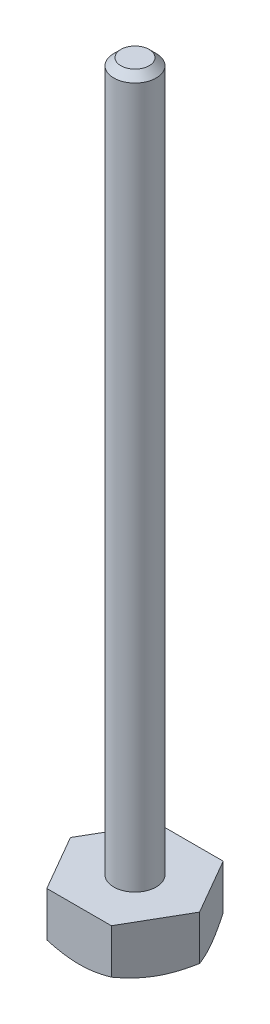
ISO-10303-21;
HEADER;
FILE_DESCRIPTION(('STEP AP214'),'2;1');
FILE_NAME('part.step','',(''),(''),'','','');
FILE_SCHEMA(('AUTOMOTIVE_DESIGN { 1 0 10303 214 1 1 1 1 }'));
ENDSEC;
DATA;
#1=APPLICATION_CONTEXT('core data for automotive mechanical design processes');
#2=APPLICATION_PROTOCOL_DEFINITION('international standard','automotive_design',2000,#1);
#3=PRODUCT_CONTEXT('',#1,'mechanical');
#4=PRODUCT('Part','Part','',(#3));
#5=PRODUCT_RELATED_PRODUCT_CATEGORY('part','',(#4));
#6=PRODUCT_DEFINITION_FORMATION('','',#4);
#7=PRODUCT_DEFINITION_CONTEXT('part definition',#1,'design');
#8=PRODUCT_DEFINITION('design','',#6,#7);
#9=PRODUCT_DEFINITION_SHAPE('','',#8);
#10=(LENGTH_UNIT() NAMED_UNIT(*) SI_UNIT(.MILLI.,.METRE.));
#11=(NAMED_UNIT(*) PLANE_ANGLE_UNIT() SI_UNIT($,.RADIAN.));
#12=(NAMED_UNIT(*) SI_UNIT($,.STERADIAN.) SOLID_ANGLE_UNIT());
#13=UNCERTAINTY_MEASURE_WITH_UNIT(LENGTH_MEASURE(1.E-05),#10,'distance_accuracy_value','');
#14=(GEOMETRIC_REPRESENTATION_CONTEXT(3) GLOBAL_UNCERTAINTY_ASSIGNED_CONTEXT((#13)) GLOBAL_UNIT_ASSIGNED_CONTEXT((#10,
#11,#12)) REPRESENTATION_CONTEXT('',''));
#15=CARTESIAN_POINT('',(0.,0.,0.));
#16=DIRECTION('',(0.,0.,1.));
#17=DIRECTION('',(1.,0.,0.));
#18=AXIS2_PLACEMENT_3D('',#15,#16,#17);
#19=CARTESIAN_POINT('',(2.28053356329902,53.5,3.95));
#20=DIRECTION('',(-0.866025403784439,0.,-0.5));
#21=DIRECTION('',(-0.5,0.,0.866025403784439));
#22=AXIS2_PLACEMENT_3D('',#19,#20,#21);
#23=PLANE('',#22);
#24=DIRECTION('',(0.,-1.,0.));
#25=VECTOR('',#24,1.);
#26=CARTESIAN_POINT('',(2.28053356329902,53.5,3.95));
#27=LINE('',#26,#25);
#28=CARTESIAN_POINT('',(2.28053356329902,3.5,3.95));
#29=VERTEX_POINT('',#28);
#30=CARTESIAN_POINT('',(2.28053356329902,0.352799770034311,3.95));
#31=VERTEX_POINT('',#30);
#32=EDGE_CURVE('E200',#29,#31,#27,.T.);
#33=ORIENTED_EDGE('',*,*,#32,.T.);
#34=CARTESIAN_POINT('',(2.28041809324518,0.352866439232559,3.9502));
#35=CARTESIAN_POINT('',(2.38063568061467,0.29498466517833,3.77661804686408));
#36=CARTESIAN_POINT('',(2.48171834047415,0.242343384693469,3.60153774422325));
#37=CARTESIAN_POINT('',(2.68563399767937,0.15045769122082,3.24834546548501));
#38=CARTESIAN_POINT('',(2.78847061820894,0.111245783680884,3.07022721384912));
#39=CARTESIAN_POINT('',(2.99286939806646,0.0502069964662325,2.71619814213081));
#40=CARTESIAN_POINT('',(3.09440010889697,0.0279738669923628,2.54034179244378));
#41=CARTESIAN_POINT('',(3.2979392458968,0.00143257410152678,2.18780166583136));
#42=CARTESIAN_POINT('',(3.39994693229981,-0.0028975682651904,2.01111917021878));
#43=CARTESIAN_POINT('',(3.59055257085472,0.0061125958312302,1.68098052003257));
#44=CARTESIAN_POINT('',(3.67917906182971,0.0172406019947407,1.52747493476735));
#45=CARTESIAN_POINT('',(3.85585464520722,0.0525092384080949,1.22146384790063));
#46=CARTESIAN_POINT('',(3.94390312656325,0.0766619154689032,1.06895940466271));
#47=CARTESIAN_POINT('',(4.1209429556258,0.137041499215026,0.762317425763064));
#48=CARTESIAN_POINT('',(4.20991189711042,0.173524342732937,0.60821869881607));
#49=CARTESIAN_POINT('',(4.386522859466,0.256325958671651,0.302319538842572));
#50=CARTESIAN_POINT('',(4.47416714283355,0.302625276645222,0.150515187057013));
#51=CARTESIAN_POINT('',(4.56118259665188,0.35286643923256,-0.000199999999999486));
#52=B_SPLINE_CURVE_WITH_KNOTS('',3,(#34,#35,#36,#37,#38,#39,#40,#41,#42,#43,#44,#45,#46,#47,#48,
#49,#50,#51),.UNSPECIFIED.,.F.,.F.,(4,2,2,2,2,2,2,2,4),(0.,0.626122435414088,1.25374984683404,
1.86584388199859,2.47718624449848,3.00948555938868,3.54227805643855,4.08688849089222,
4.63042953105667),.UNSPECIFIED.);
#53=CARTESIAN_POINT('',(3.42080034494853,0.,1.975));
#54=VERTEX_POINT('',#53);
#55=EDGE_CURVE('E56',#31,#54,#52,.T.);
#56=ORIENTED_EDGE('',*,*,#55,.T.);
#57=CARTESIAN_POINT('',(4.56106712659804,0.352799770034312,0.));
#58=VERTEX_POINT('',#57);
#59=EDGE_CURVE('E180',#54,#58,#52,.T.);
#60=ORIENTED_EDGE('',*,*,#59,.T.);
#61=DIRECTION('',(0.,-1.,0.));
#62=VECTOR('',#61,1.);
#63=CARTESIAN_POINT('',(4.56106712659804,53.5,0.));
#64=LINE('',#63,#62);
#65=CARTESIAN_POINT('',(4.56106712659804,3.5,0.));
#66=VERTEX_POINT('',#65);
#67=EDGE_CURVE('E212',#66,#58,#64,.T.);
#68=ORIENTED_EDGE('',*,*,#67,.F.);
#69=DIRECTION('',(0.5,0.,-0.866025403784439));
#70=VECTOR('',#69,1.);
#71=CARTESIAN_POINT('',(2.28053356329902,3.5,3.95));
#72=LINE('',#71,#70);
#73=EDGE_CURVE('E198',#29,#66,#72,.T.);
#74=ORIENTED_EDGE('',*,*,#73,.F.);
#75=EDGE_LOOP('',(#33,#56,#60,#68,#74));
#76=FACE_BOUND('',#75,.T.);
#77=ADVANCED_FACE('F34',(#76),#23,.F.);
#78=CARTESIAN_POINT('',(4.56106712659804,53.5,0.));
#79=DIRECTION('',(-0.866025403784438,0.,0.5));
#80=DIRECTION('',(0.5,0.,0.866025403784439));
#81=AXIS2_PLACEMENT_3D('',#78,#79,#80);
#82=PLANE('',#81);
#83=ORIENTED_EDGE('',*,*,#67,.T.);
#84=CARTESIAN_POINT('',(4.56118259665188,0.35286643923256,0.000200000000000792));
#85=CARTESIAN_POINT('',(4.4609650092824,0.294984665178331,-0.173381953135922));
#86=CARTESIAN_POINT('',(4.35988234942291,0.24234338469347,-0.348462255776748));
#87=CARTESIAN_POINT('',(4.15596669221769,0.150457691220819,-0.701654534514986));
#88=CARTESIAN_POINT('',(4.05313007168813,0.111245783680884,-0.879772786150876));
#89=CARTESIAN_POINT('',(3.84873129183061,0.0502069964662322,-1.23380185786919));
#90=CARTESIAN_POINT('',(3.74720058100009,0.0279738669923626,-1.40965820755622));
#91=CARTESIAN_POINT('',(3.54366144400027,0.00143257410152646,-1.76219833416864));
#92=CARTESIAN_POINT('',(3.44165375759725,-0.002897568265191,-1.93888082978122));
#93=CARTESIAN_POINT('',(3.25104811904234,0.00611259583122921,-2.26901947996743));
#94=CARTESIAN_POINT('',(3.16242162806736,0.0172406019947396,-2.42252506523265));
#95=CARTESIAN_POINT('',(2.98574604468985,0.0525092384080937,-2.72853615209937));
#96=CARTESIAN_POINT('',(2.89769756333382,0.0766619154689019,-2.88104059533729));
#97=CARTESIAN_POINT('',(2.72065773427127,0.137041499215025,-3.18768257423694));
#98=CARTESIAN_POINT('',(2.63168879278664,0.173524342732935,-3.34178130118393));
#99=CARTESIAN_POINT('',(2.45507783043106,0.25632595867165,-3.64768046115743));
#100=CARTESIAN_POINT('',(2.36743354706351,0.302625276645221,-3.79948481294299));
#101=CARTESIAN_POINT('',(2.28041809324518,0.352866439232559,-3.9502));
#102=B_SPLINE_CURVE_WITH_KNOTS('',3,(#84,#85,#86,#87,#88,#89,#90,#91,#92,#93,#94,#95,#96,#97,
#98,#99,#100,#101),.UNSPECIFIED.,.F.,.F.,(4,2,2,2,2,2,2,2,4),(0.,0.626122435414089,
1.25374984683404,1.86584388199859,2.47718624449848,3.00948555938868,3.54227805643855,
4.08688849089222,4.63042953105668),.UNSPECIFIED.);
#103=CARTESIAN_POINT('',(3.42080034494853,0.,-1.975));
#104=VERTEX_POINT('',#103);
#105=EDGE_CURVE('E143',#58,#104,#102,.T.);
#106=ORIENTED_EDGE('',*,*,#105,.T.);
#107=CARTESIAN_POINT('',(2.28053356329902,0.352799770034311,-3.95));
#108=VERTEX_POINT('',#107);
#109=EDGE_CURVE('E125',#104,#108,#102,.T.);
#110=ORIENTED_EDGE('',*,*,#109,.T.);
#111=DIRECTION('',(0.,-1.,0.));
#112=VECTOR('',#111,1.);
#113=CARTESIAN_POINT('',(2.28053356329902,53.5,-3.95));
#114=LINE('',#113,#112);
#115=CARTESIAN_POINT('',(2.28053356329902,3.5,-3.95));
#116=VERTEX_POINT('',#115);
#117=EDGE_CURVE('E142',#116,#108,#114,.T.);
#118=ORIENTED_EDGE('',*,*,#117,.F.);
#119=DIRECTION('',(-0.5,0.,-0.866025403784439));
#120=VECTOR('',#119,1.);
#121=CARTESIAN_POINT('',(4.56106712659804,3.5,0.));
#122=LINE('',#121,#120);
#123=EDGE_CURVE('E196',#66,#116,#122,.T.);
#124=ORIENTED_EDGE('',*,*,#123,.F.);
#125=EDGE_LOOP('',(#83,#106,#110,#118,#124));
#126=FACE_BOUND('',#125,.T.);
#127=ADVANCED_FACE('F171',(#126),#82,.F.);
#128=CARTESIAN_POINT('',(2.28053356329902,53.5,-3.95));
#129=DIRECTION('',(0.,0.,1.));
#130=DIRECTION('',(1.,0.,0.));
#131=AXIS2_PLACEMENT_3D('',#128,#129,#130);
#132=PLANE('',#131);
#133=ORIENTED_EDGE('',*,*,#117,.T.);
#134=CARTESIAN_POINT('',(-6.10357758199648,1.91693231106891,-3.95));
#135=CARTESIAN_POINT('',(-5.93124296341037,1.83342413986499,-3.95));
#136=CARTESIAN_POINT('',(-5.75851034716177,1.7507231237423,-3.95));
#137=CARTESIAN_POINT('',(-5.41203738808505,1.58738980517233,-3.95));
#138=CARTESIAN_POINT('',(-5.23829688964106,1.50675783320087,-3.95));
#139=CARTESIAN_POINT('',(-4.88869053692414,1.34760657001449,-3.95));
#140=CARTESIAN_POINT('',(-4.71281824674957,1.26910136723712,-3.95));
#141=CARTESIAN_POINT('',(-4.35966706590354,1.11533340183023,-3.95));
#142=CARTESIAN_POINT('',(-4.18238824282438,1.04007048449381,-3.95));
#143=CARTESIAN_POINT('',(-3.82050032721837,0.89132492021823,-3.95));
#144=CARTESIAN_POINT('',(-3.63583679895024,0.817973982970938,-3.95));
#145=CARTESIAN_POINT('',(-3.26434104766608,0.676877601703548,-3.95));
#146=CARTESIAN_POINT('',(-3.07750858274522,0.60913278992708,-3.95));
#147=CARTESIAN_POINT('',(-2.70173475211593,0.481043410509852,-3.95));
#148=CARTESIAN_POINT('',(-2.51279861234366,0.420683666781782,-3.95));
#149=CARTESIAN_POINT('',(-2.13221628603157,0.309315998631552,-3.95));
#150=CARTESIAN_POINT('',(-1.9405709808664,0.258305104875555,-3.95));
#151=CARTESIAN_POINT('',(-1.55552434463117,0.168368778188127,-3.95));
#152=CARTESIAN_POINT('',(-1.36213845471526,0.129378460835559,-3.95));
#153=CARTESIAN_POINT('',(-0.972985101602572,0.0657013823696122,-3.95));
#154=CARTESIAN_POINT('',(-0.777217857929892,0.0410133128601275,-3.95));
#155=CARTESIAN_POINT('',(-0.386827068328998,0.00823383358748254,-3.95));
#156=CARTESIAN_POINT('',(-0.192221734876161,-6.91438180813361E-05,-3.95));
#157=CARTESIAN_POINT('',(0.196997929016572,6.99774314488553E-05,-3.95));
#158=CARTESIAN_POINT('',(0.391612259559857,0.00851243380211182,-3.95));
#159=CARTESIAN_POINT('',(0.722677109724479,0.0365237749212534,-3.95));
#160=CARTESIAN_POINT('',(0.859484148618515,0.0521141661874182,-3.95));
#161=CARTESIAN_POINT('',(1.13207609093672,0.0905871323117199,-3.95));
#162=CARTESIAN_POINT('',(1.26786085001275,0.113470717925195,-3.95));
#163=CARTESIAN_POINT('',(1.67351297163642,0.191856311837088,-3.95));
#164=CARTESIAN_POINT('',(1.94152194628906,0.257078202966896,-3.95));
#165=CARTESIAN_POINT('',(2.34222812581931,0.369908571745236,-3.95));
#166=CARTESIAN_POINT('',(2.47700932246483,0.410535217395792,-3.95));
#167=CARTESIAN_POINT('',(2.74526197374985,0.49594181803233,-3.95));
#168=CARTESIAN_POINT('',(2.87873341992142,0.540721799851382,-3.95));
#169=CARTESIAN_POINT('',(3.1444100594592,0.633722017418443,-3.95));
#170=CARTESIAN_POINT('',(3.27661566965515,0.68194107318557,-3.95));
#171=CARTESIAN_POINT('',(3.53993613663676,0.781258796495595,-3.95));
#172=CARTESIAN_POINT('',(3.67105100463013,0.83235743440785,-3.95));
#173=CARTESIAN_POINT('',(3.97386714290639,0.95359226728304,-3.95));
#174=CARTESIAN_POINT('',(4.1452130929492,1.02461418324626,-3.95));
#175=CARTESIAN_POINT('',(4.48649853133974,1.16996930194956,-3.95));
#176=CARTESIAN_POINT('',(4.65643794353951,1.2443026825951,-3.95));
#177=CARTESIAN_POINT('',(4.99516077724692,1.3956337735108,-3.95));
#178=CARTESIAN_POINT('',(5.16394398064623,1.47263197074913,-3.95));
#179=CARTESIAN_POINT('',(5.50051447925895,1.62877818362153,-3.95));
#180=CARTESIAN_POINT('',(5.66830175446394,1.70792624226988,-3.95));
#181=CARTESIAN_POINT('',(6.17072112904776,1.94813182359853,-3.95));
#182=CARTESIAN_POINT('',(6.50409969730983,2.11180990992146,-3.95));
#183=CARTESIAN_POINT('',(7.16846869153804,2.44394123801235,-3.95));
#184=CARTESIAN_POINT('',(7.49945903325812,2.61239464720944,-3.95));
#185=CARTESIAN_POINT('',(8.13304098864775,2.93898775889549,-3.95));
#186=CARTESIAN_POINT('',(8.4357691875192,3.09686298206285,-3.95));
#187=CARTESIAN_POINT('',(9.04008916358199,3.41479351154543,-3.95));
#188=CARTESIAN_POINT('',(9.34168090395802,3.57484888772418,-3.95));
#189=CARTESIAN_POINT('',(9.9432653473041,3.8962513165353,-3.95));
#190=CARTESIAN_POINT('',(10.243260141572,4.05759445986514,-3.95));
#191=CARTESIAN_POINT('',(10.8425188719185,4.38159580299575,-3.95));
#192=CARTESIAN_POINT('',(11.1417828452411,4.5442539338812,-3.95));
#193=CARTESIAN_POINT('',(11.4407759086026,4.70740493554459,-3.95));
#194=B_SPLINE_CURVE_WITH_KNOTS('',3,(#134,#135,#136,#137,#138,#139,#140,#141,#142,#143,#144,
#145,#146,#147,#148,#149,#150,#151,#152,#153,#154,#155,#156,#157,#158,#159,#160,#161,#162,#163,
#164,#165,#166,#167,#168,#169,#170,#171,#172,#173,#174,#175,#176,#177,#178,#179,#180,#181,#182,
#183,#184,#185,#186,#187,#188,#189,#190,#191,#192,#193),.UNSPECIFIED.,.F.,.F.,(4,2,2,2,2,2,2,2,
2,2,2,2,2,2,2,2,2,2,2,2,2,2,2,2,2,2,2,2,2,4),(0.,0.574511714877499,1.14911462891598,
1.72688352304033,2.3046248180952,2.90064911574734,3.49674054005759,4.09158567320565,
4.68624154602117,5.27762900624728,5.86896235670716,6.45260899073125,7.03626809273551,
7.44914484842698,7.86207884912884,8.68841555975474,9.11069388963043,9.53297494787033,
9.95511180785677,10.3772443248853,10.9336439344889,11.4900734722945,12.0466052344872,
12.6031481399434,13.7172581519158,14.8314072744837,15.8556614473226,16.8799485202109,
17.9018335532885,18.9236653746146),.UNSPECIFIED.);
#195=CARTESIAN_POINT('',(0.,0.,-3.95));
#196=VERTEX_POINT('',#195);
#197=EDGE_CURVE('E118',#108,#196,#194,.F.);
#198=ORIENTED_EDGE('',*,*,#197,.T.);
#199=CARTESIAN_POINT('',(-2.28053356329902,0.352799770034311,-3.95));
#200=VERTEX_POINT('',#199);
#201=EDGE_CURVE('E106',#196,#200,#194,.F.);
#202=ORIENTED_EDGE('',*,*,#201,.T.);
#203=DIRECTION('',(0.,-1.,0.));
#204=VECTOR('',#203,1.);
#205=CARTESIAN_POINT('',(-2.28053356329902,53.5,-3.95));
#206=LINE('',#205,#204);
#207=CARTESIAN_POINT('',(-2.28053356329902,3.5,-3.95));
#208=VERTEX_POINT('',#207);
#209=EDGE_CURVE('E209',#208,#200,#206,.T.);
#210=ORIENTED_EDGE('',*,*,#209,.F.);
#211=DIRECTION('',(-1.,0.,0.));
#212=VECTOR('',#211,1.);
#213=CARTESIAN_POINT('',(2.28053356329902,3.5,-3.95));
#214=LINE('',#213,#212);
#215=EDGE_CURVE('E194',#116,#208,#214,.T.);
#216=ORIENTED_EDGE('',*,*,#215,.F.);
#217=EDGE_LOOP('',(#133,#198,#202,#210,#216));
#218=FACE_BOUND('',#217,.T.);
#219=ADVANCED_FACE('F139',(#218),#132,.F.);
#220=CARTESIAN_POINT('',(-2.28053356329902,53.5,-3.95));
#221=DIRECTION('',(0.866025403784439,0.,0.5));
#222=DIRECTION('',(0.5,0.,-0.866025403784439));
#223=AXIS2_PLACEMENT_3D('',#220,#221,#222);
#224=PLANE('',#223);
#225=ORIENTED_EDGE('',*,*,#209,.T.);
#226=CARTESIAN_POINT('',(-2.28041809324518,0.352866439232559,-3.9502));
#227=CARTESIAN_POINT('',(-2.38063568061467,0.29498466517833,-3.77661804686408));
#228=CARTESIAN_POINT('',(-2.48171834047415,0.242343384693469,-3.60153774422325));
#229=CARTESIAN_POINT('',(-2.68563399767937,0.15045769122082,-3.24834546548501));
#230=CARTESIAN_POINT('',(-2.78847061820894,0.111245783680884,-3.07022721384912));
#231=CARTESIAN_POINT('',(-2.99286939806646,0.0502069964662324,-2.71619814213081));
#232=CARTESIAN_POINT('',(-3.09440010889697,0.0279738669923625,-2.54034179244378));
#233=CARTESIAN_POINT('',(-3.29793924589679,0.00143257410152648,-2.18780166583136));
#234=CARTESIAN_POINT('',(-3.39994693229981,-0.00289756826519048,-2.01111917021878));
#235=CARTESIAN_POINT('',(-3.59055257085472,0.00611259583122976,-1.68098052003257));
#236=CARTESIAN_POINT('',(-3.67917906182971,0.0172406019947398,-1.52747493476735));
#237=CARTESIAN_POINT('',(-3.85585464520722,0.0525092384080938,-1.22146384790063));
#238=CARTESIAN_POINT('',(-3.94390312656325,0.0766619154689024,-1.06895940466271));
#239=CARTESIAN_POINT('',(-4.1209429556258,0.137041499215026,-0.762317425763064));
#240=CARTESIAN_POINT('',(-4.20991189711042,0.173524342732936,-0.60821869881607));
#241=CARTESIAN_POINT('',(-4.386522859466,0.256325958671651,-0.302319538842571));
#242=CARTESIAN_POINT('',(-4.47416714283355,0.302625276645221,-0.150515187057012));
#243=CARTESIAN_POINT('',(-4.56118259665188,0.352866439232559,0.000200000000000661));
#244=B_SPLINE_CURVE_WITH_KNOTS('',3,(#226,#227,#228,#229,#230,#231,#232,#233,#234,#235,#236,
#237,#238,#239,#240,#241,#242,#243),.UNSPECIFIED.,.F.,.F.,(4,2,2,2,2,2,2,2,4),(0.,
0.626122435414089,1.25374984683404,1.86584388199859,2.47718624449848,3.00948555938868,
3.54227805643855,4.08688849089222,4.63042953105668),.UNSPECIFIED.);
#245=CARTESIAN_POINT('',(-3.42080034494853,0.,-1.975));
#246=VERTEX_POINT('',#245);
#247=EDGE_CURVE('E113',#200,#246,#244,.T.);
#248=ORIENTED_EDGE('',*,*,#247,.T.);
#249=CARTESIAN_POINT('',(-4.56106712659804,0.352799770034311,0.));
#250=VERTEX_POINT('',#249);
#251=EDGE_CURVE('E152',#246,#250,#244,.T.);
#252=ORIENTED_EDGE('',*,*,#251,.T.);
#253=DIRECTION('',(0.,-1.,0.));
#254=VECTOR('',#253,1.);
#255=CARTESIAN_POINT('',(-4.56106712659804,53.5,0.));
#256=LINE('',#255,#254);
#257=CARTESIAN_POINT('',(-4.56106712659804,3.5,0.));
#258=VERTEX_POINT('',#257);
#259=EDGE_CURVE('E206',#258,#250,#256,.T.);
#260=ORIENTED_EDGE('',*,*,#259,.F.);
#261=DIRECTION('',(-0.5,0.,0.866025403784439));
#262=VECTOR('',#261,1.);
#263=CARTESIAN_POINT('',(-2.28053356329902,3.5,-3.95));
#264=LINE('',#263,#262);
#265=EDGE_CURVE('E192',#208,#258,#264,.T.);
#266=ORIENTED_EDGE('',*,*,#265,.F.);
#267=EDGE_LOOP('',(#225,#248,#252,#260,#266));
#268=FACE_BOUND('',#267,.T.);
#269=ADVANCED_FACE('F170',(#268),#224,.F.);
#270=CARTESIAN_POINT('',(-4.56106712659804,53.5,0.));
#271=DIRECTION('',(0.866025403784439,0.,-0.5));
#272=DIRECTION('',(-0.5,0.,-0.866025403784439));
#273=AXIS2_PLACEMENT_3D('',#270,#271,#272);
#274=PLANE('',#273);
#275=ORIENTED_EDGE('',*,*,#259,.T.);
#276=CARTESIAN_POINT('',(-4.56118259665188,0.352866439232559,-0.000199999999999148));
#277=CARTESIAN_POINT('',(-4.4609650092824,0.29498466517833,0.173381953135924));
#278=CARTESIAN_POINT('',(-4.35988234942291,0.242343384693469,0.34846225577675));
#279=CARTESIAN_POINT('',(-4.15596669221769,0.15045769122082,0.701654534514988));
#280=CARTESIAN_POINT('',(-4.05313007168813,0.111245783680884,0.879772786150879));
#281=CARTESIAN_POINT('',(-3.8487312918306,0.0502069964662323,1.23380185786919));
#282=CARTESIAN_POINT('',(-3.74720058100009,0.0279738669923624,1.40965820755622));
#283=CARTESIAN_POINT('',(-3.54366144400027,0.0014325741015265,1.76219833416864));
#284=CARTESIAN_POINT('',(-3.44165375759725,-0.00289756826519031,1.93888082978122));
#285=CARTESIAN_POINT('',(-3.25104811904234,0.00611259583123015,2.26901947996743));
#286=CARTESIAN_POINT('',(-3.16242162806736,0.0172406019947403,2.42252506523265));
#287=CARTESIAN_POINT('',(-2.98574604468985,0.0525092384080944,2.72853615209937));
#288=CARTESIAN_POINT('',(-2.89769756333382,0.0766619154689029,2.8810405953373));
#289=CARTESIAN_POINT('',(-2.72065773427127,0.137041499215026,3.18768257423694));
#290=CARTESIAN_POINT('',(-2.63168879278664,0.173524342732936,3.34178130118393));
#291=CARTESIAN_POINT('',(-2.45507783043106,0.25632595867165,3.64768046115743));
#292=CARTESIAN_POINT('',(-2.36743354706351,0.30262527664522,3.79948481294299));
#293=CARTESIAN_POINT('',(-2.28041809324518,0.352866439232559,3.9502));
#294=B_SPLINE_CURVE_WITH_KNOTS('',3,(#276,#277,#278,#279,#280,#281,#282,#283,#284,#285,#286,
#287,#288,#289,#290,#291,#292,#293),.UNSPECIFIED.,.F.,.F.,(4,2,2,2,2,2,2,2,4),(0.,
0.62612243541409,1.25374984683404,1.86584388199859,2.47718624449848,3.00948555938868,
3.54227805643855,4.08688849089222,4.63042953105667),.UNSPECIFIED.);
#295=CARTESIAN_POINT('',(-3.42080034494853,0.,1.975));
#296=VERTEX_POINT('',#295);
#297=EDGE_CURVE('E224',#250,#296,#294,.T.);
#298=ORIENTED_EDGE('',*,*,#297,.T.);
#299=CARTESIAN_POINT('',(-2.28053356329983,0.352799770033768,3.95));
#300=VERTEX_POINT('',#299);
#301=EDGE_CURVE('E227',#296,#300,#294,.T.);
#302=ORIENTED_EDGE('',*,*,#301,.T.);
#303=DIRECTION('',(0.,-1.,0.));
#304=VECTOR('',#303,1.);
#305=CARTESIAN_POINT('',(-2.28053356329902,53.5,3.95));
#306=LINE('',#305,#304);
#307=CARTESIAN_POINT('',(-2.28053356329902,3.5,3.95));
#308=VERTEX_POINT('',#307);
#309=EDGE_CURVE('E203',#308,#300,#306,.T.);
#310=ORIENTED_EDGE('',*,*,#309,.F.);
#311=DIRECTION('',(0.5,0.,0.866025403784439));
#312=VECTOR('',#311,1.);
#313=CARTESIAN_POINT('',(-4.56106712659804,3.5,0.));
#314=LINE('',#313,#312);
#315=EDGE_CURVE('E190',#258,#308,#314,.T.);
#316=ORIENTED_EDGE('',*,*,#315,.F.);
#317=EDGE_LOOP('',(#275,#298,#302,#310,#316));
#318=FACE_BOUND('',#317,.T.);
#319=ADVANCED_FACE('F225',(#318),#274,.F.);
#320=CARTESIAN_POINT('',(-2.28053356329902,53.5,3.95));
#321=DIRECTION('',(0.,0.,-1.));
#322=DIRECTION('',(-1.,0.,0.));
#323=AXIS2_PLACEMENT_3D('',#320,#321,#322);
#324=PLANE('',#323);
#325=ORIENTED_EDGE('',*,*,#309,.T.);
#326=CARTESIAN_POINT('',(-6.10357758202227,1.91693231108141,3.95));
#327=CARTESIAN_POINT('',(-5.9312429634353,1.83342413987697,3.95));
#328=CARTESIAN_POINT('',(-5.75851034718583,1.75072312375375,3.95));
#329=CARTESIAN_POINT('',(-5.41203738810737,1.58738980518274,3.95));
#330=CARTESIAN_POINT('',(-5.23829688966251,1.50675783321076,3.95));
#331=CARTESIAN_POINT('',(-4.88869053694384,1.34760657002333,3.95));
#332=CARTESIAN_POINT('',(-4.71281824676839,1.26910136724545,3.95));
#333=CARTESIAN_POINT('',(-4.35966706592059,1.11533340183752,3.95));
#334=CARTESIAN_POINT('',(-4.18238824284054,1.04007048450059,3.95));
#335=CARTESIAN_POINT('',(-3.82050032723268,0.891324920223971,3.95));
#336=CARTESIAN_POINT('',(-3.6358367989636,0.817973982976156,3.95));
#337=CARTESIAN_POINT('',(-3.26434104767752,0.676877601707747,3.95));
#338=CARTESIAN_POINT('',(-3.07750858275568,0.609132789930784,3.95));
#339=CARTESIAN_POINT('',(-2.70173475212444,0.481043410512614,3.95));
#340=CARTESIAN_POINT('',(-2.51279861235118,0.420683666784097,3.95));
#341=CARTESIAN_POINT('',(-2.13221628603708,0.309315998633048,3.95));
#342=CARTESIAN_POINT('',(-1.9405709808709,0.258305104876681,3.95));
#343=CARTESIAN_POINT('',(-1.5555243446331,0.168368778188504,3.95));
#344=CARTESIAN_POINT('',(-1.36213845471563,0.12937846083559,3.95));
#345=CARTESIAN_POINT('',(-0.9729851015998,0.0657013823691887,3.95));
#346=CARTESIAN_POINT('',(-0.777217857925527,0.0410133128595953,3.95));
#347=CARTESIAN_POINT('',(-0.386827068321476,0.00823383358701458,3.95));
#348=CARTESIAN_POINT('',(-0.192221734867074,-6.91438183812688E-05,3.95));
#349=CARTESIAN_POINT('',(0.196997929028762,6.99774317547079E-05,3.95));
#350=CARTESIAN_POINT('',(0.391612259573586,0.00851243380285552,3.95));
#351=CARTESIAN_POINT('',(0.722677109740162,0.0365237749228761,3.95));
#352=CARTESIAN_POINT('',(0.859484148634632,0.0521141661893918,3.95));
#353=CARTESIAN_POINT('',(1.13207609095368,0.0905871323144141,3.95));
#354=CARTESIAN_POINT('',(1.26786085003013,0.113470717928259,3.95));
#355=CARTESIAN_POINT('',(1.67351297165502,0.191856311841269,3.95));
#356=CARTESIAN_POINT('',(1.94152194630844,0.257078202971833,3.95));
#357=CARTESIAN_POINT('',(2.34222812583986,0.369908571751288,3.95));
#358=CARTESIAN_POINT('',(2.47700932248578,0.410535217402219,3.95));
#359=CARTESIAN_POINT('',(2.7452619737716,0.495941818039494,3.95));
#360=CARTESIAN_POINT('',(2.87873341994356,0.54072179985891,3.95));
#361=CARTESIAN_POINT('',(3.14441005948213,0.633722017426687,3.95));
#362=CARTESIAN_POINT('',(3.27661566967847,0.681941073194165,3.95));
#363=CARTESIAN_POINT('',(3.53993613666086,0.781258796504881,3.95));
#364=CARTESIAN_POINT('',(3.67105100465462,0.832357434417475,3.95));
#365=CARTESIAN_POINT('',(3.97386714293116,0.953592267293187,3.95));
#366=CARTESIAN_POINT('',(4.14521309297386,1.02461418325657,3.95));
#367=CARTESIAN_POINT('',(4.4864985313642,1.16996930196016,3.95));
#368=CARTESIAN_POINT('',(4.65643794356387,1.24430268260582,3.95));
#369=CARTESIAN_POINT('',(4.9951607772711,1.39563377352175,3.95));
#370=CARTESIAN_POINT('',(5.16394398067032,1.47263197076018,3.95));
#371=CARTESIAN_POINT('',(5.50051447928288,1.62877818363276,3.95));
#372=CARTESIAN_POINT('',(5.6683017544878,1.70792624228118,3.95));
#373=CARTESIAN_POINT('',(6.17072112907139,1.94813182361004,3.95));
#374=CARTESIAN_POINT('',(6.50409969733332,2.11180990993306,3.95));
#375=CARTESIAN_POINT('',(7.16846869156128,2.44394123802411,3.95));
#376=CARTESIAN_POINT('',(7.49945903328123,2.61239464722125,3.95));
#377=CARTESIAN_POINT('',(8.13304098867073,2.93898775890743,3.95));
#378=CARTESIAN_POINT('',(8.43576918754216,3.09686298207485,3.95));
#379=CARTESIAN_POINT('',(9.04008916360492,3.41479351155756,3.95));
#380=CARTESIAN_POINT('',(9.34168090398093,3.57484888773637,3.95));
#381=CARTESIAN_POINT('',(9.94326534732702,3.8962513165476,3.95));
#382=CARTESIAN_POINT('',(10.2432601415949,4.05759445987749,3.95));
#383=CARTESIAN_POINT('',(10.8425188719414,4.38159580300819,3.95));
#384=CARTESIAN_POINT('',(11.141782845264,4.54425393389369,3.94999999999999));
#385=CARTESIAN_POINT('',(11.4407759086256,4.70740493555712,3.95));
#386=B_SPLINE_CURVE_WITH_KNOTS('',3,(#326,#327,#328,#329,#330,#331,#332,#333,#334,#335,#336,
#337,#338,#339,#340,#341,#342,#343,#344,#345,#346,#347,#348,#349,#350,#351,#352,#353,#354,#355,
#356,#357,#358,#359,#360,#361,#362,#363,#364,#365,#366,#367,#368,#369,#370,#371,#372,#373,#374,
#375,#376,#377,#378,#379,#380,#381,#382,#383,#384,#385),.UNSPECIFIED.,.F.,.F.,(4,2,2,2,2,2,2,2,
2,2,2,2,2,2,2,2,2,2,2,2,2,2,2,2,2,2,2,2,2,4),(0.,0.574511714880523,1.14911462892202,
1.72688352304944,2.30462481810736,2.90064911576274,3.49674054007624,4.09158567322752,
4.68624154604627,5.27762900627716,5.8689623567418,6.45260899077054,7.03626809277945,
7.44914484847233,7.8620788491756,8.68841555980432,9.11069388968148,9.53297494792285,
9.95511180791075,10.3772443249407,10.9336439345442,11.4900734723497,12.0466052345423,
12.6031481399984,13.7172581519706,14.8314072745382,15.8556614473771,16.8799485202656,
17.9018335533432,18.9236653746694),.UNSPECIFIED.);
#387=CARTESIAN_POINT('',(0.,0.,3.95));
#388=VERTEX_POINT('',#387);
#389=EDGE_CURVE('E232',#300,#388,#386,.T.);
#390=ORIENTED_EDGE('',*,*,#389,.T.);
#391=EDGE_CURVE('E130',#388,#31,#386,.T.);
#392=ORIENTED_EDGE('',*,*,#391,.T.);
#393=ORIENTED_EDGE('',*,*,#32,.F.);
#394=DIRECTION('',(1.,0.,0.));
#395=VECTOR('',#394,1.);
#396=CARTESIAN_POINT('',(-2.28053356329902,3.5,3.95));
#397=LINE('',#396,#395);
#398=EDGE_CURVE('E215',#308,#29,#397,.T.);
#399=ORIENTED_EDGE('',*,*,#398,.F.);
#400=EDGE_LOOP('',(#325,#390,#392,#393,#399));
#401=FACE_BOUND('',#400,.T.);
#402=ADVANCED_FACE('F245',(#401),#324,.F.);
#403=CARTESIAN_POINT('',(0.,3.5,0.));
#404=DIRECTION('',(0.,1.,0.));
#405=DIRECTION('',(0.,0.,1.));
#406=AXIS2_PLACEMENT_3D('',#403,#404,#405);
#407=PLANE('',#406);
#408=CARTESIAN_POINT('',(0.,3.5,0.));
#409=DIRECTION('',(0.,1.,0.));
#410=DIRECTION('',(0.,0.,1.));
#411=AXIS2_PLACEMENT_3D('',#408,#409,#410);
#412=CIRCLE('',#411,1.5);
#413=CARTESIAN_POINT('',(0.,3.5,1.5));
#414=VERTEX_POINT('',#413);
#415=EDGE_CURVE('E187',#414,#414,#412,.T.);
#416=ORIENTED_EDGE('',*,*,#415,.F.);
#417=EDGE_LOOP('',(#416));
#418=FACE_BOUND('',#417,.T.);
#419=ORIENTED_EDGE('',*,*,#73,.T.);
#420=ORIENTED_EDGE('',*,*,#123,.T.);
#421=ORIENTED_EDGE('',*,*,#215,.T.);
#422=ORIENTED_EDGE('',*,*,#265,.T.);
#423=ORIENTED_EDGE('',*,*,#315,.T.);
#424=ORIENTED_EDGE('',*,*,#398,.T.);
#425=EDGE_LOOP('',(#419,#420,#421,#422,#423,#424));
#426=FACE_BOUND('',#425,.T.);
#427=ADVANCED_FACE('F249',(#418,#426),#407,.T.);
#428=CARTESIAN_POINT('',(0.,3.5,0.));
#429=DIRECTION('',(0.,1.,0.));
#430=DIRECTION('',(0.,0.,1.));
#431=AXIS2_PLACEMENT_3D('',#428,#429,#430);
#432=CYLINDRICAL_SURFACE('',#431,1.5);
#433=CARTESIAN_POINT('',(0.,53.,0.));
#434=DIRECTION('',(0.,1.,0.));
#435=DIRECTION('',(0.,0.,1.));
#436=AXIS2_PLACEMENT_3D('',#433,#434,#435);
#437=CIRCLE('',#436,1.5);
#438=CARTESIAN_POINT('',(0.,53.,1.5));
#439=VERTEX_POINT('',#438);
#440=EDGE_CURVE('E12',#439,#439,#437,.F.);
#441=ORIENTED_EDGE('',*,*,#440,.T.);
#442=EDGE_LOOP('',(#441));
#443=FACE_BOUND('',#442,.T.);
#444=ORIENTED_EDGE('',*,*,#415,.T.);
#445=EDGE_LOOP('',(#444));
#446=FACE_BOUND('',#445,.T.);
#447=ADVANCED_FACE('F257',(#443,#446),#432,.T.);
#448=CARTESIAN_POINT('',(0.,53.5,0.));
#449=DIRECTION('',(0.,1.,0.));
#450=DIRECTION('',(0.,0.,1.));
#451=AXIS2_PLACEMENT_3D('',#448,#449,#450);
#452=PLANE('',#451);
#453=CARTESIAN_POINT('',(0.,53.5,0.));
#454=DIRECTION('',(0.,1.,0.));
#455=DIRECTION('',(0.,0.,1.));
#456=AXIS2_PLACEMENT_3D('',#453,#454,#455);
#457=CIRCLE('',#456,1.);
#458=CARTESIAN_POINT('',(0.,53.5,1.));
#459=VERTEX_POINT('',#458);
#460=EDGE_CURVE('E42',#459,#459,#457,.T.);
#461=ORIENTED_EDGE('',*,*,#460,.T.);
#462=EDGE_LOOP('',(#461));
#463=FACE_BOUND('',#462,.T.);
#464=ADVANCED_FACE('F254',(#463),#452,.T.);
#465=CARTESIAN_POINT('',(0.,0.75,0.));
#466=DIRECTION('',(0.,1.,0.));
#467=DIRECTION('',(0.,0.,1.));
#468=AXIS2_PLACEMENT_3D('',#465,#466,#467);
#469=CONICAL_SURFACE('',#468,5.24903810567666,1.0471975511966);
#470=ORIENTED_EDGE('',*,*,#391,.F.);
#471=CARTESIAN_POINT('',(0.,0.,0.));
#472=DIRECTION('',(0.,1.,0.));
#473=DIRECTION('',(0.,0.,1.));
#474=AXIS2_PLACEMENT_3D('',#471,#472,#473);
#475=CIRCLE('',#474,3.95);
#476=EDGE_CURVE('E216',#54,#388,#475,.F.);
#477=ORIENTED_EDGE('',*,*,#476,.F.);
#478=ORIENTED_EDGE('',*,*,#55,.F.);
#479=EDGE_LOOP('',(#470,#477,#478));
#480=FACE_BOUND('',#479,.T.);
#481=ADVANCED_FACE('F165',(#480),#469,.T.);
#482=EDGE_CURVE('E136',#104,#54,#475,.F.);
#483=ORIENTED_EDGE('',*,*,#482,.F.);
#484=ORIENTED_EDGE('',*,*,#105,.F.);
#485=ORIENTED_EDGE('',*,*,#59,.F.);
#486=EDGE_LOOP('',(#483,#484,#485));
#487=FACE_BOUND('',#486,.T.);
#488=ADVANCED_FACE('F274',(#487),#469,.T.);
#489=CARTESIAN_POINT('',(0.,0.,0.));
#490=DIRECTION('',(0.,-1.,0.));
#491=DIRECTION('',(0.,0.,-1.));
#492=AXIS2_PLACEMENT_3D('',#489,#490,#491);
#493=CIRCLE('',#492,3.95);
#494=EDGE_CURVE('E122',#196,#104,#493,.T.);
#495=ORIENTED_EDGE('',*,*,#494,.F.);
#496=ORIENTED_EDGE('',*,*,#197,.F.);
#497=ORIENTED_EDGE('',*,*,#109,.F.);
#498=EDGE_LOOP('',(#495,#496,#497));
#499=FACE_BOUND('',#498,.T.);
#500=ADVANCED_FACE('F123',(#499),#469,.T.);
#501=EDGE_CURVE('E110',#246,#196,#475,.F.);
#502=ORIENTED_EDGE('',*,*,#501,.F.);
#503=ORIENTED_EDGE('',*,*,#247,.F.);
#504=ORIENTED_EDGE('',*,*,#201,.F.);
#505=EDGE_LOOP('',(#502,#503,#504));
#506=FACE_BOUND('',#505,.T.);
#507=ADVANCED_FACE('F108',(#506),#469,.T.);
#508=EDGE_CURVE('E135',#296,#246,#475,.F.);
#509=ORIENTED_EDGE('',*,*,#508,.F.);
#510=ORIENTED_EDGE('',*,*,#297,.F.);
#511=ORIENTED_EDGE('',*,*,#251,.F.);
#512=EDGE_LOOP('',(#509,#510,#511));
#513=FACE_BOUND('',#512,.T.);
#514=ADVANCED_FACE('F275',(#513),#469,.T.);
#515=EDGE_CURVE('E49',#388,#296,#475,.F.);
#516=ORIENTED_EDGE('',*,*,#515,.F.);
#517=ORIENTED_EDGE('',*,*,#389,.F.);
#518=ORIENTED_EDGE('',*,*,#301,.F.);
#519=EDGE_LOOP('',(#516,#517,#518));
#520=FACE_BOUND('',#519,.T.);
#521=ADVANCED_FACE('F253',(#520),#469,.T.);
#522=CARTESIAN_POINT('',(0.,0.,0.));
#523=DIRECTION('',(0.,1.,0.));
#524=DIRECTION('',(0.,0.,1.));
#525=AXIS2_PLACEMENT_3D('',#522,#523,#524);
#526=PLANE('',#525);
#527=ORIENTED_EDGE('',*,*,#476,.T.);
#528=ORIENTED_EDGE('',*,*,#515,.T.);
#529=ORIENTED_EDGE('',*,*,#508,.T.);
#530=ORIENTED_EDGE('',*,*,#501,.T.);
#531=ORIENTED_EDGE('',*,*,#494,.T.);
#532=ORIENTED_EDGE('',*,*,#482,.T.);
#533=EDGE_LOOP('',(#527,#528,#529,#530,#531,#532));
#534=FACE_BOUND('',#533,.T.);
#535=ADVANCED_FACE('F133',(#534),#526,.F.);
#536=CARTESIAN_POINT('',(0.,53.5,0.));
#537=DIRECTION('',(0.,-1.,0.));
#538=DIRECTION('',(0.,0.,-1.));
#539=AXIS2_PLACEMENT_3D('',#536,#537,#538);
#540=CONICAL_SURFACE('',#539,1.,0.785398163397447);
#541=ORIENTED_EDGE('',*,*,#440,.F.);
#542=EDGE_LOOP('',(#541));
#543=FACE_BOUND('',#542,.T.);
#544=ORIENTED_EDGE('',*,*,#460,.F.);
#545=EDGE_LOOP('',(#544));
#546=FACE_BOUND('',#545,.T.);
#547=ADVANCED_FACE('F36',(#543,#546),#540,.T.);
#548=CLOSED_SHELL('',(#77,#127,#219,#269,#319,#402,#427,#447,#464,#481,#488,#500,#507,#514,#521,
#535,#547));
#549=MANIFOLD_SOLID_BREP('B2',#548);
#550=ADVANCED_BREP_SHAPE_REPRESENTATION('',(#18,#549),#14);
#551=SHAPE_DEFINITION_REPRESENTATION(#9,#550);
ENDSEC;
END-ISO-10303-21;
